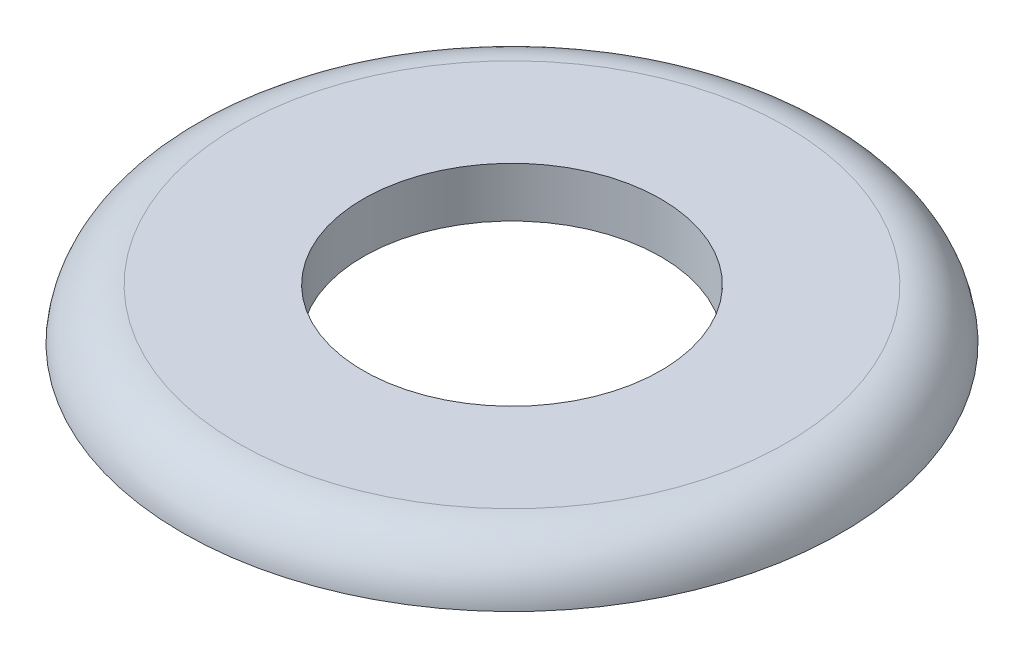
ISO-10303-21;
HEADER;
FILE_DESCRIPTION(('STEP AP214'),'2;1');
FILE_NAME('part.step','',(''),(''),'','','');
FILE_SCHEMA(('AUTOMOTIVE_DESIGN { 1 0 10303 214 1 1 1 1 }'));
ENDSEC;
DATA;
#1=APPLICATION_CONTEXT('core data for automotive mechanical design processes');
#2=APPLICATION_PROTOCOL_DEFINITION('international standard','automotive_design',2000,#1);
#3=PRODUCT_CONTEXT('',#1,'mechanical');
#4=PRODUCT('Part','Part','',(#3));
#5=PRODUCT_RELATED_PRODUCT_CATEGORY('part','',(#4));
#6=PRODUCT_DEFINITION_FORMATION('','',#4);
#7=PRODUCT_DEFINITION_CONTEXT('part definition',#1,'design');
#8=PRODUCT_DEFINITION('design','',#6,#7);
#9=PRODUCT_DEFINITION_SHAPE('','',#8);
#10=(LENGTH_UNIT() NAMED_UNIT(*) SI_UNIT(.MILLI.,.METRE.));
#11=(NAMED_UNIT(*) PLANE_ANGLE_UNIT() SI_UNIT($,.RADIAN.));
#12=(NAMED_UNIT(*) SI_UNIT($,.STERADIAN.) SOLID_ANGLE_UNIT());
#13=UNCERTAINTY_MEASURE_WITH_UNIT(LENGTH_MEASURE(1.E-05),#10,'distance_accuracy_value','');
#14=(GEOMETRIC_REPRESENTATION_CONTEXT(3) GLOBAL_UNCERTAINTY_ASSIGNED_CONTEXT((#13)) GLOBAL_UNIT_ASSIGNED_CONTEXT((#10,
#11,#12)) REPRESENTATION_CONTEXT('',''));
#15=CARTESIAN_POINT('',(0.,0.,0.));
#16=DIRECTION('',(0.,0.,1.));
#17=DIRECTION('',(1.,0.,0.));
#18=AXIS2_PLACEMENT_3D('',#15,#16,#17);
#19=CARTESIAN_POINT('',(430.015803575593,-688.919505369382,508.755371132133));
#20=DIRECTION('',(0.,1.,0.));
#21=DIRECTION('',(0.,0.,1.));
#22=AXIS2_PLACEMENT_3D('',#19,#20,#21);
#23=PLANE('',#22);
#24=CARTESIAN_POINT('',(430.015803575593,-688.919505369382,512.525683632133));
#25=DIRECTION('',(0.,-1.,0.));
#26=DIRECTION('',(0.,0.,-1.));
#27=AXIS2_PLACEMENT_3D('',#24,#25,#26);
#28=CIRCLE('',#27,2.04542483721732);
#29=CARTESIAN_POINT('',(430.015803575593,-688.919505369382,510.480258794916));
#30=VERTEX_POINT('',#29);
#31=EDGE_CURVE('E18',#30,#30,#28,.T.);
#32=ORIENTED_EDGE('',*,*,#31,.T.);
#33=EDGE_LOOP('',(#32));
#34=FACE_BOUND('',#33,.T.);
#35=CARTESIAN_POINT('',(430.015803575593,-688.919505369382,512.525683632133));
#36=DIRECTION('',(0.,-1.,0.));
#37=DIRECTION('',(0.,0.,-1.));
#38=AXIS2_PLACEMENT_3D('',#35,#36,#37);
#39=CIRCLE('',#38,3.7703125);
#40=CARTESIAN_POINT('',(430.015803575593,-688.919505369382,508.755371132133));
#41=VERTEX_POINT('',#40);
#42=EDGE_CURVE('E30',#41,#41,#39,.T.);
#43=ORIENTED_EDGE('',*,*,#42,.F.);
#44=EDGE_LOOP('',(#43));
#45=FACE_BOUND('',#44,.T.);
#46=ADVANCED_FACE('F15',(#34,#45),#23,.T.);
#47=CARTESIAN_POINT('',(430.015803575593,-689.606892869382,510.480258794916));
#48=DIRECTION('',(0.,-1.,0.));
#49=DIRECTION('',(0.,0.,-1.));
#50=AXIS2_PLACEMENT_3D('',#47,#48,#49);
#51=PLANE('',#50);
#52=CARTESIAN_POINT('',(430.015803575593,-689.606892869382,512.525683632133));
#53=DIRECTION('',(0.,-1.,0.));
#54=DIRECTION('',(0.,0.,-1.));
#55=AXIS2_PLACEMENT_3D('',#52,#53,#54);
#56=CIRCLE('',#55,2.04542483721732);
#57=CARTESIAN_POINT('',(430.015803575593,-689.606892869382,510.480258794916));
#58=VERTEX_POINT('',#57);
#59=EDGE_CURVE('E10',#58,#58,#56,.T.);
#60=ORIENTED_EDGE('',*,*,#59,.F.);
#61=EDGE_LOOP('',(#60));
#62=FACE_BOUND('',#61,.T.);
#63=CARTESIAN_POINT('',(430.015803575593,-689.606892869382,512.525683632133));
#64=DIRECTION('',(0.,-1.,0.));
#65=DIRECTION('',(0.,0.,-1.));
#66=AXIS2_PLACEMENT_3D('',#63,#64,#65);
#67=CIRCLE('',#66,4.53008840785458);
#68=CARTESIAN_POINT('',(430.015803575593,-689.606892869382,507.995595224278));
#69=VERTEX_POINT('',#68);
#70=EDGE_CURVE('E32',#69,#69,#67,.T.);
#71=ORIENTED_EDGE('',*,*,#70,.T.);
#72=EDGE_LOOP('',(#71));
#73=FACE_BOUND('',#72,.T.);
#74=ADVANCED_FACE('F44',(#62,#73),#51,.T.);
#75=CARTESIAN_POINT('',(430.015803575593,-689.606892869382,512.525683632133));
#76=DIRECTION('',(0.,-1.,0.));
#77=DIRECTION('',(0.,0.,-1.));
#78=AXIS2_PLACEMENT_3D('',#75,#76,#77);
#79=CYLINDRICAL_SURFACE('',#78,2.04542483721732);
#80=ORIENTED_EDGE('',*,*,#59,.T.);
#81=EDGE_LOOP('',(#80));
#82=FACE_BOUND('',#81,.T.);
#83=ORIENTED_EDGE('',*,*,#31,.F.);
#84=EDGE_LOOP('',(#83));
#85=FACE_BOUND('',#84,.T.);
#86=ADVANCED_FACE('F48',(#82,#85),#79,.F.);
#87=CARTESIAN_POINT('',(430.015803575593,-689.683092869382,512.525683632133));
#88=DIRECTION('',(0.,-1.,0.));
#89=DIRECTION('',(0.,0.,-1.));
#90=AXIS2_PLACEMENT_3D('',#87,#88,#89);
#91=TOROIDAL_SURFACE('',#90,3.7703125,0.7635875);
#92=ORIENTED_EDGE('',*,*,#42,.T.);
#93=EDGE_LOOP('',(#92));
#94=FACE_BOUND('',#93,.T.);
#95=ORIENTED_EDGE('',*,*,#70,.F.);
#96=EDGE_LOOP('',(#95));
#97=FACE_BOUND('',#96,.T.);
#98=ADVANCED_FACE('F46',(#94,#97),#91,.T.);
#99=CLOSED_SHELL('',(#46,#74,#86,#98));
#100=MANIFOLD_SOLID_BREP('B1',#99);
#101=ADVANCED_BREP_SHAPE_REPRESENTATION('',(#18,#100),#14);
#102=SHAPE_DEFINITION_REPRESENTATION(#9,#101);
ENDSEC;
END-ISO-10303-21;
